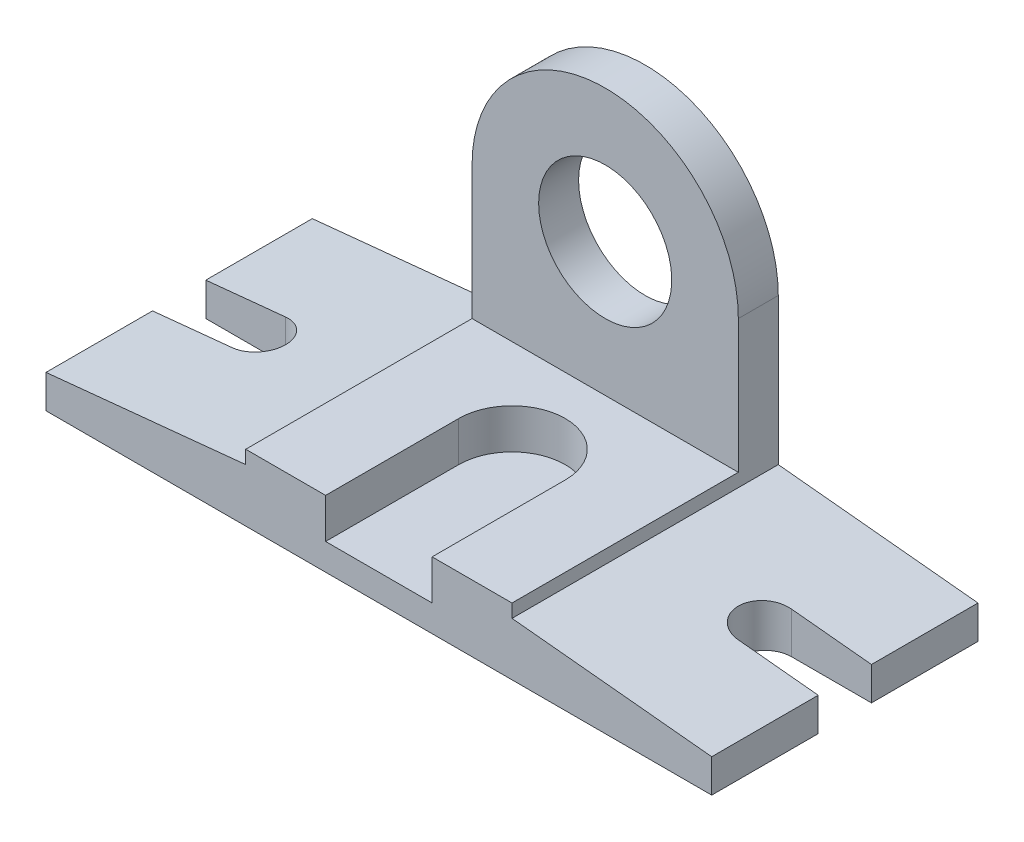
ISO-10303-21;
HEADER;
FILE_DESCRIPTION(('STEP AP214'),'2;1');
FILE_NAME('part.step','',(''),(''),'','','');
FILE_SCHEMA(('AUTOMOTIVE_DESIGN { 1 0 10303 214 1 1 1 1 }'));
ENDSEC;
DATA;
#1=APPLICATION_CONTEXT('core data for automotive mechanical design processes');
#2=APPLICATION_PROTOCOL_DEFINITION('international standard','automotive_design',2000,#1);
#3=PRODUCT_CONTEXT('',#1,'mechanical');
#4=PRODUCT('Part','Part','',(#3));
#5=PRODUCT_RELATED_PRODUCT_CATEGORY('part','',(#4));
#6=PRODUCT_DEFINITION_FORMATION('','',#4);
#7=PRODUCT_DEFINITION_CONTEXT('part definition',#1,'design');
#8=PRODUCT_DEFINITION('design','',#6,#7);
#9=PRODUCT_DEFINITION_SHAPE('','',#8);
#10=(LENGTH_UNIT() NAMED_UNIT(*) SI_UNIT(.MILLI.,.METRE.));
#11=(NAMED_UNIT(*) PLANE_ANGLE_UNIT() SI_UNIT($,.RADIAN.));
#12=(NAMED_UNIT(*) SI_UNIT($,.STERADIAN.) SOLID_ANGLE_UNIT());
#13=UNCERTAINTY_MEASURE_WITH_UNIT(LENGTH_MEASURE(1.E-05),#10,'distance_accuracy_value','');
#14=(GEOMETRIC_REPRESENTATION_CONTEXT(3) GLOBAL_UNCERTAINTY_ASSIGNED_CONTEXT((#13)) GLOBAL_UNIT_ASSIGNED_CONTEXT((#10,
#11,#12)) REPRESENTATION_CONTEXT('',''));
#15=CARTESIAN_POINT('',(0.,0.,0.));
#16=DIRECTION('',(0.,0.,1.));
#17=DIRECTION('',(1.,0.,0.));
#18=AXIS2_PLACEMENT_3D('',#15,#16,#17);
#19=CARTESIAN_POINT('',(-100.,50.,-200.));
#20=DIRECTION('',(0.,1.,0.));
#21=DIRECTION('',(0.,0.,1.));
#22=AXIS2_PLACEMENT_3D('',#19,#20,#21);
#23=PLANE('',#22);
#24=DIRECTION('',(0.,0.,1.));
#25=VECTOR('',#24,1.);
#26=CARTESIAN_POINT('',(100.,50.,-200.));
#27=LINE('',#26,#25);
#28=CARTESIAN_POINT('',(100.,50.,-170.));
#29=VERTEX_POINT('',#28);
#30=CARTESIAN_POINT('',(100.,50.,0.));
#31=VERTEX_POINT('',#30);
#32=EDGE_CURVE('E345',#29,#31,#27,.T.);
#33=ORIENTED_EDGE('',*,*,#32,.F.);
#34=DIRECTION('',(-1.,0.,0.));
#35=VECTOR('',#34,1.);
#36=CARTESIAN_POINT('',(-100.,50.,-170.));
#37=LINE('',#36,#35);
#38=CARTESIAN_POINT('',(-100.,50.,-170.));
#39=VERTEX_POINT('',#38);
#40=EDGE_CURVE('E217',#29,#39,#37,.T.);
#41=ORIENTED_EDGE('',*,*,#40,.T.);
#42=DIRECTION('',(0.,0.,1.));
#43=VECTOR('',#42,1.);
#44=CARTESIAN_POINT('',(-100.,50.,-200.));
#45=LINE('',#44,#43);
#46=CARTESIAN_POINT('',(-100.,50.,0.));
#47=VERTEX_POINT('',#46);
#48=EDGE_CURVE('E216',#39,#47,#45,.T.);
#49=ORIENTED_EDGE('',*,*,#48,.T.);
#50=DIRECTION('',(-1.,0.,0.));
#51=VECTOR('',#50,1.);
#52=CARTESIAN_POINT('',(-100.,50.,0.));
#53=LINE('',#52,#51);
#54=CARTESIAN_POINT('',(-40.,50.,0.));
#55=VERTEX_POINT('',#54);
#56=EDGE_CURVE('E333',#55,#47,#53,.T.);
#57=ORIENTED_EDGE('',*,*,#56,.F.);
#58=DIRECTION('',(0.,0.,1.));
#59=VECTOR('',#58,1.);
#60=CARTESIAN_POINT('',(-40.,50.,-100.));
#61=LINE('',#60,#59);
#62=CARTESIAN_POINT('',(-40.,50.,-100.));
#63=VERTEX_POINT('',#62);
#64=EDGE_CURVE('E285',#63,#55,#61,.T.);
#65=ORIENTED_EDGE('',*,*,#64,.F.);
#66=CARTESIAN_POINT('',(0.,50.,-100.));
#67=DIRECTION('',(0.,1.,0.));
#68=DIRECTION('',(0.,0.,1.));
#69=AXIS2_PLACEMENT_3D('',#66,#67,#68);
#70=CIRCLE('',#69,40.);
#71=CARTESIAN_POINT('',(40.,50.,-100.));
#72=VERTEX_POINT('',#71);
#73=EDGE_CURVE('E270',#72,#63,#70,.T.);
#74=ORIENTED_EDGE('',*,*,#73,.F.);
#75=DIRECTION('',(0.,0.,-1.));
#76=VECTOR('',#75,1.);
#77=CARTESIAN_POINT('',(40.,50.,-100.));
#78=LINE('',#77,#76);
#79=CARTESIAN_POINT('',(40.,50.,0.));
#80=VERTEX_POINT('',#79);
#81=EDGE_CURVE('E275',#80,#72,#78,.T.);
#82=ORIENTED_EDGE('',*,*,#81,.F.);
#83=EDGE_CURVE('E334',#31,#80,#53,.T.);
#84=ORIENTED_EDGE('',*,*,#83,.F.);
#85=EDGE_LOOP('',(#33,#41,#49,#57,#65,#74,#82,#84));
#86=FACE_BOUND('',#85,.T.);
#87=ADVANCED_FACE('F44',(#86),#23,.T.);
#88=CARTESIAN_POINT('',(-250.,0.,-200.));
#89=DIRECTION('',(-1.,0.,0.));
#90=DIRECTION('',(0.,0.,1.));
#91=AXIS2_PLACEMENT_3D('',#88,#89,#90);
#92=PLANE('',#91);
#93=DIRECTION('',(0.,-1.,0.));
#94=VECTOR('',#93,1.);
#95=CARTESIAN_POINT('',(-250.,50.,-120.));
#96=LINE('',#95,#94);
#97=CARTESIAN_POINT('',(-250.,25.,-120.));
#98=VERTEX_POINT('',#97);
#99=CARTESIAN_POINT('',(-250.,0.,-120.));
#100=VERTEX_POINT('',#99);
#101=EDGE_CURVE('E238',#98,#100,#96,.T.);
#102=ORIENTED_EDGE('',*,*,#101,.F.);
#103=DIRECTION('',(0.,0.,1.));
#104=VECTOR('',#103,1.);
#105=CARTESIAN_POINT('',(-250.,25.,-200.));
#106=LINE('',#105,#104);
#107=CARTESIAN_POINT('',(-250.,25.,-200.));
#108=VERTEX_POINT('',#107);
#109=EDGE_CURVE('E13',#108,#98,#106,.T.);
#110=ORIENTED_EDGE('',*,*,#109,.F.);
#111=DIRECTION('',(0.,-1.,0.));
#112=VECTOR('',#111,1.);
#113=CARTESIAN_POINT('',(-250.,0.,-200.));
#114=LINE('',#113,#112);
#115=CARTESIAN_POINT('',(-250.,0.,-200.));
#116=VERTEX_POINT('',#115);
#117=EDGE_CURVE('E298',#108,#116,#114,.T.);
#118=ORIENTED_EDGE('',*,*,#117,.T.);
#119=DIRECTION('',(0.,0.,1.));
#120=VECTOR('',#119,1.);
#121=CARTESIAN_POINT('',(-250.,0.,-200.));
#122=LINE('',#121,#120);
#123=EDGE_CURVE('E48',#116,#100,#122,.T.);
#124=ORIENTED_EDGE('',*,*,#123,.T.);
#125=EDGE_LOOP('',(#102,#110,#118,#124));
#126=FACE_BOUND('',#125,.T.);
#127=ADVANCED_FACE('F388',(#126),#92,.T.);
#128=CARTESIAN_POINT('',(250.,25.,-200.));
#129=DIRECTION('',(1.,0.,0.));
#130=DIRECTION('',(0.,0.,-1.));
#131=AXIS2_PLACEMENT_3D('',#128,#129,#130);
#132=PLANE('',#131);
#133=DIRECTION('',(0.,-1.,0.));
#134=VECTOR('',#133,1.);
#135=CARTESIAN_POINT('',(250.,50.,-80.));
#136=LINE('',#135,#134);
#137=CARTESIAN_POINT('',(250.,25.,-80.));
#138=VERTEX_POINT('',#137);
#139=CARTESIAN_POINT('',(250.,0.,-80.));
#140=VERTEX_POINT('',#139);
#141=EDGE_CURVE('E252',#138,#140,#136,.T.);
#142=ORIENTED_EDGE('',*,*,#141,.F.);
#143=DIRECTION('',(0.,0.,1.));
#144=VECTOR('',#143,1.);
#145=CARTESIAN_POINT('',(250.,25.,-200.));
#146=LINE('',#145,#144);
#147=CARTESIAN_POINT('',(250.,25.,0.));
#148=VERTEX_POINT('',#147);
#149=EDGE_CURVE('E351',#138,#148,#146,.T.);
#150=ORIENTED_EDGE('',*,*,#149,.T.);
#151=DIRECTION('',(0.,1.,0.));
#152=VECTOR('',#151,1.);
#153=CARTESIAN_POINT('',(250.,25.,0.));
#154=LINE('',#153,#152);
#155=CARTESIAN_POINT('',(250.,0.,0.));
#156=VERTEX_POINT('',#155);
#157=EDGE_CURVE('E324',#156,#148,#154,.T.);
#158=ORIENTED_EDGE('',*,*,#157,.F.);
#159=DIRECTION('',(0.,0.,1.));
#160=VECTOR('',#159,1.);
#161=CARTESIAN_POINT('',(250.,0.,-200.));
#162=LINE('',#161,#160);
#163=EDGE_CURVE('E354',#140,#156,#162,.T.);
#164=ORIENTED_EDGE('',*,*,#163,.F.);
#165=EDGE_LOOP('',(#142,#150,#158,#164));
#166=FACE_BOUND('',#165,.T.);
#167=ADVANCED_FACE('F415',(#166),#132,.T.);
#168=DIRECTION('',(0.,-1.,0.));
#169=VECTOR('',#168,1.);
#170=CARTESIAN_POINT('',(-250.,50.,-80.));
#171=LINE('',#170,#169);
#172=CARTESIAN_POINT('',(-250.,25.,-80.));
#173=VERTEX_POINT('',#172);
#174=CARTESIAN_POINT('',(-250.,0.,-80.));
#175=VERTEX_POINT('',#174);
#176=EDGE_CURVE('E240',#173,#175,#171,.T.);
#177=ORIENTED_EDGE('',*,*,#176,.T.);
#178=CARTESIAN_POINT('',(-250.,0.,0.));
#179=VERTEX_POINT('',#178);
#180=EDGE_CURVE('E318',#175,#179,#122,.T.);
#181=ORIENTED_EDGE('',*,*,#180,.T.);
#182=DIRECTION('',(0.,-1.,0.));
#183=VECTOR('',#182,1.);
#184=CARTESIAN_POINT('',(-250.,0.,0.));
#185=LINE('',#184,#183);
#186=CARTESIAN_POINT('',(-250.,25.,0.));
#187=VERTEX_POINT('',#186);
#188=EDGE_CURVE('E291',#187,#179,#185,.T.);
#189=ORIENTED_EDGE('',*,*,#188,.F.);
#190=EDGE_CURVE('E53',#173,#187,#106,.T.);
#191=ORIENTED_EDGE('',*,*,#190,.F.);
#192=EDGE_LOOP('',(#177,#181,#189,#191));
#193=FACE_BOUND('',#192,.T.);
#194=ADVANCED_FACE('F46',(#193),#92,.T.);
#195=CARTESIAN_POINT('',(-100.,40.,-200.));
#196=DIRECTION('',(-0.0995037190209989,0.995037190209989,0.));
#197=DIRECTION('',(-0.995037190209989,-0.0995037190209989,0.));
#198=AXIS2_PLACEMENT_3D('',#195,#196,#197);
#199=PLANE('',#198);
#200=DIRECTION('',(-0.995037190209989,-0.0995037190209989,0.));
#201=VECTOR('',#200,1.);
#202=CARTESIAN_POINT('',(-100.,40.,-120.));
#203=LINE('',#202,#201);
#204=CARTESIAN_POINT('',(-190.,31.,-120.));
#205=VERTEX_POINT('',#204);
#206=EDGE_CURVE('E266',#205,#98,#203,.T.);
#207=ORIENTED_EDGE('',*,*,#206,.F.);
#208=CARTESIAN_POINT('',(-190.,31.,-100.));
#209=DIRECTION('',(-0.0995037190209989,0.995037190209989,0.));
#210=DIRECTION('',(-0.995037190209989,-0.0995037190209989,0.));
#211=AXIS2_PLACEMENT_3D('',#208,#209,#210);
#212=ELLIPSE('',#211,20.0997512422418,20.);
#213=CARTESIAN_POINT('',(-190.,31.,-80.));
#214=VERTEX_POINT('',#213);
#215=EDGE_CURVE('E268',#214,#205,#212,.T.);
#216=ORIENTED_EDGE('',*,*,#215,.F.);
#217=DIRECTION('',(0.995037190209989,0.0995037190209989,0.));
#218=VECTOR('',#217,1.);
#219=CARTESIAN_POINT('',(-100.,40.,-80.));
#220=LINE('',#219,#218);
#221=EDGE_CURVE('E264',#173,#214,#220,.T.);
#222=ORIENTED_EDGE('',*,*,#221,.F.);
#223=ORIENTED_EDGE('',*,*,#190,.T.);
#224=DIRECTION('',(-0.995037190209989,-0.0995037190209989,0.));
#225=VECTOR('',#224,1.);
#226=CARTESIAN_POINT('',(-100.,40.,0.));
#227=LINE('',#226,#225);
#228=CARTESIAN_POINT('',(-100.,40.,0.));
#229=VERTEX_POINT('',#228);
#230=EDGE_CURVE('E302',#229,#187,#227,.T.);
#231=ORIENTED_EDGE('',*,*,#230,.F.);
#232=DIRECTION('',(0.,0.,1.));
#233=VECTOR('',#232,1.);
#234=CARTESIAN_POINT('',(-100.,40.,-200.));
#235=LINE('',#234,#233);
#236=CARTESIAN_POINT('',(-100.,40.,-200.));
#237=VERTEX_POINT('',#236);
#238=EDGE_CURVE('E342',#237,#229,#235,.T.);
#239=ORIENTED_EDGE('',*,*,#238,.F.);
#240=DIRECTION('',(-0.995037190209989,-0.0995037190209989,0.));
#241=VECTOR('',#240,1.);
#242=CARTESIAN_POINT('',(-100.,40.,-200.));
#243=LINE('',#242,#241);
#244=EDGE_CURVE('E315',#237,#108,#243,.T.);
#245=ORIENTED_EDGE('',*,*,#244,.T.);
#246=ORIENTED_EDGE('',*,*,#109,.T.);
#247=EDGE_LOOP('',(#207,#216,#222,#223,#231,#239,#245,#246));
#248=FACE_BOUND('',#247,.T.);
#249=ADVANCED_FACE('F377',(#248),#199,.T.);
#250=CARTESIAN_POINT('',(-100.,50.,-200.));
#251=DIRECTION('',(-1.,0.,0.));
#252=DIRECTION('',(0.,0.,1.));
#253=AXIS2_PLACEMENT_3D('',#250,#251,#252);
#254=PLANE('',#253);
#255=DIRECTION('',(0.,-1.,0.));
#256=VECTOR('',#255,1.);
#257=CARTESIAN_POINT('',(-100.,50.,0.));
#258=LINE('',#257,#256);
#259=EDGE_CURVE('E337',#47,#229,#258,.T.);
#260=ORIENTED_EDGE('',*,*,#259,.F.);
#261=ORIENTED_EDGE('',*,*,#48,.F.);
#262=DIRECTION('',(0.,1.,0.));
#263=VECTOR('',#262,1.);
#264=CARTESIAN_POINT('',(-100.,150.,-170.));
#265=LINE('',#264,#263);
#266=CARTESIAN_POINT('',(-100.,150.,-170.));
#267=VERTEX_POINT('',#266);
#268=EDGE_CURVE('E61',#39,#267,#265,.T.);
#269=ORIENTED_EDGE('',*,*,#268,.T.);
#270=DIRECTION('',(0.,0.,-1.));
#271=VECTOR('',#270,1.);
#272=CARTESIAN_POINT('',(-100.,150.,-170.));
#273=LINE('',#272,#271);
#274=CARTESIAN_POINT('',(-100.,150.,-200.));
#275=VERTEX_POINT('',#274);
#276=EDGE_CURVE('E198',#267,#275,#273,.T.);
#277=ORIENTED_EDGE('',*,*,#276,.T.);
#278=DIRECTION('',(0.,-1.,0.));
#279=VECTOR('',#278,1.);
#280=CARTESIAN_POINT('',(-100.,50.,-200.));
#281=LINE('',#280,#279);
#282=EDGE_CURVE('E313',#275,#237,#281,.T.);
#283=ORIENTED_EDGE('',*,*,#282,.T.);
#284=ORIENTED_EDGE('',*,*,#238,.T.);
#285=EDGE_LOOP('',(#260,#261,#269,#277,#283,#284));
#286=FACE_BOUND('',#285,.T.);
#287=ADVANCED_FACE('F215',(#286),#254,.T.);
#288=CARTESIAN_POINT('',(100.,50.,-200.));
#289=DIRECTION('',(1.,0.,0.));
#290=DIRECTION('',(0.,0.,-1.));
#291=AXIS2_PLACEMENT_3D('',#288,#289,#290);
#292=PLANE('',#291);
#293=DIRECTION('',(0.,1.,0.));
#294=VECTOR('',#293,1.);
#295=CARTESIAN_POINT('',(100.,50.,0.));
#296=LINE('',#295,#294);
#297=CARTESIAN_POINT('',(100.,40.,0.));
#298=VERTEX_POINT('',#297);
#299=EDGE_CURVE('E330',#298,#31,#296,.T.);
#300=ORIENTED_EDGE('',*,*,#299,.F.);
#301=DIRECTION('',(0.,0.,1.));
#302=VECTOR('',#301,1.);
#303=CARTESIAN_POINT('',(100.,40.,-200.));
#304=LINE('',#303,#302);
#305=CARTESIAN_POINT('',(100.,40.,-200.));
#306=VERTEX_POINT('',#305);
#307=EDGE_CURVE('E347',#306,#298,#304,.T.);
#308=ORIENTED_EDGE('',*,*,#307,.F.);
#309=DIRECTION('',(0.,1.,0.));
#310=VECTOR('',#309,1.);
#311=CARTESIAN_POINT('',(100.,50.,-200.));
#312=LINE('',#311,#310);
#313=CARTESIAN_POINT('',(100.,150.,-200.));
#314=VERTEX_POINT('',#313);
#315=EDGE_CURVE('E311',#306,#314,#312,.T.);
#316=ORIENTED_EDGE('',*,*,#315,.T.);
#317=DIRECTION('',(0.,0.,-1.));
#318=VECTOR('',#317,1.);
#319=CARTESIAN_POINT('',(100.,150.,-170.));
#320=LINE('',#319,#318);
#321=CARTESIAN_POINT('',(100.,150.,-170.));
#322=VERTEX_POINT('',#321);
#323=EDGE_CURVE('E207',#322,#314,#320,.T.);
#324=ORIENTED_EDGE('',*,*,#323,.F.);
#325=DIRECTION('',(0.,-1.,0.));
#326=VECTOR('',#325,1.);
#327=CARTESIAN_POINT('',(100.,50.,-170.));
#328=LINE('',#327,#326);
#329=EDGE_CURVE('E208',#322,#29,#328,.T.);
#330=ORIENTED_EDGE('',*,*,#329,.T.);
#331=ORIENTED_EDGE('',*,*,#32,.T.);
#332=EDGE_LOOP('',(#300,#308,#316,#324,#330,#331));
#333=FACE_BOUND('',#332,.T.);
#334=ADVANCED_FACE('F419',(#333),#292,.T.);
#335=CARTESIAN_POINT('',(100.,40.,-200.));
#336=DIRECTION('',(0.0995037190209989,0.995037190209989,0.));
#337=DIRECTION('',(-0.995037190209989,0.0995037190209989,0.));
#338=AXIS2_PLACEMENT_3D('',#335,#336,#337);
#339=PLANE('',#338);
#340=DIRECTION('',(0.995037190209989,-0.0995037190209989,0.));
#341=VECTOR('',#340,1.);
#342=CARTESIAN_POINT('',(100.,40.,-80.));
#343=LINE('',#342,#341);
#344=CARTESIAN_POINT('',(190.,31.,-80.));
#345=VERTEX_POINT('',#344);
#346=EDGE_CURVE('E260',#345,#138,#343,.T.);
#347=ORIENTED_EDGE('',*,*,#346,.F.);
#348=CARTESIAN_POINT('',(190.,31.,-100.));
#349=DIRECTION('',(0.0995037190209989,0.995037190209989,0.));
#350=DIRECTION('',(0.995037190209989,-0.0995037190209989,0.));
#351=AXIS2_PLACEMENT_3D('',#348,#349,#350);
#352=ELLIPSE('',#351,20.0997512422418,20.);
#353=CARTESIAN_POINT('',(190.,31.,-120.));
#354=VERTEX_POINT('',#353);
#355=EDGE_CURVE('E262',#354,#345,#352,.T.);
#356=ORIENTED_EDGE('',*,*,#355,.F.);
#357=DIRECTION('',(-0.995037190209989,0.0995037190209989,0.));
#358=VECTOR('',#357,1.);
#359=CARTESIAN_POINT('',(100.,40.,-120.));
#360=LINE('',#359,#358);
#361=CARTESIAN_POINT('',(250.,25.,-120.));
#362=VERTEX_POINT('',#361);
#363=EDGE_CURVE('E237',#362,#354,#360,.T.);
#364=ORIENTED_EDGE('',*,*,#363,.F.);
#365=CARTESIAN_POINT('',(250.,25.,-200.));
#366=VERTEX_POINT('',#365);
#367=EDGE_CURVE('E349',#366,#362,#146,.T.);
#368=ORIENTED_EDGE('',*,*,#367,.F.);
#369=DIRECTION('',(-0.995037190209989,0.0995037190209989,0.));
#370=VECTOR('',#369,1.);
#371=CARTESIAN_POINT('',(100.,40.,-200.));
#372=LINE('',#371,#370);
#373=EDGE_CURVE('E308',#366,#306,#372,.T.);
#374=ORIENTED_EDGE('',*,*,#373,.T.);
#375=ORIENTED_EDGE('',*,*,#307,.T.);
#376=DIRECTION('',(-0.995037190209989,0.0995037190209989,0.));
#377=VECTOR('',#376,1.);
#378=CARTESIAN_POINT('',(100.,40.,0.));
#379=LINE('',#378,#377);
#380=EDGE_CURVE('E327',#148,#298,#379,.T.);
#381=ORIENTED_EDGE('',*,*,#380,.F.);
#382=ORIENTED_EDGE('',*,*,#149,.F.);
#383=EDGE_LOOP('',(#347,#356,#364,#368,#374,#375,#381,#382));
#384=FACE_BOUND('',#383,.T.);
#385=ADVANCED_FACE('F405',(#384),#339,.T.);
#386=DIRECTION('',(0.,-1.,0.));
#387=VECTOR('',#386,1.);
#388=CARTESIAN_POINT('',(250.,50.,-120.));
#389=LINE('',#388,#387);
#390=CARTESIAN_POINT('',(250.,0.,-120.));
#391=VERTEX_POINT('',#390);
#392=EDGE_CURVE('E254',#362,#391,#389,.T.);
#393=ORIENTED_EDGE('',*,*,#392,.T.);
#394=CARTESIAN_POINT('',(250.,0.,-200.));
#395=VERTEX_POINT('',#394);
#396=EDGE_CURVE('E352',#395,#391,#162,.T.);
#397=ORIENTED_EDGE('',*,*,#396,.F.);
#398=DIRECTION('',(0.,1.,0.));
#399=VECTOR('',#398,1.);
#400=CARTESIAN_POINT('',(250.,25.,-200.));
#401=LINE('',#400,#399);
#402=EDGE_CURVE('E305',#395,#366,#401,.T.);
#403=ORIENTED_EDGE('',*,*,#402,.T.);
#404=ORIENTED_EDGE('',*,*,#367,.T.);
#405=EDGE_LOOP('',(#393,#397,#403,#404));
#406=FACE_BOUND('',#405,.T.);
#407=ADVANCED_FACE('F397',(#406),#132,.T.);
#408=CARTESIAN_POINT('',(-250.,0.,-200.));
#409=DIRECTION('',(0.,-1.,0.));
#410=DIRECTION('',(0.,0.,-1.));
#411=AXIS2_PLACEMENT_3D('',#408,#409,#410);
#412=PLANE('',#411);
#413=DIRECTION('',(1.,0.,0.));
#414=VECTOR('',#413,1.);
#415=CARTESIAN_POINT('',(-190.,0.,-120.));
#416=LINE('',#415,#414);
#417=CARTESIAN_POINT('',(-190.,0.,-120.));
#418=VERTEX_POINT('',#417);
#419=EDGE_CURVE('E231',#100,#418,#416,.T.);
#420=ORIENTED_EDGE('',*,*,#419,.F.);
#421=ORIENTED_EDGE('',*,*,#123,.F.);
#422=DIRECTION('',(1.,0.,0.));
#423=VECTOR('',#422,1.);
#424=CARTESIAN_POINT('',(-250.,0.,-200.));
#425=LINE('',#424,#423);
#426=EDGE_CURVE('E301',#116,#395,#425,.T.);
#427=ORIENTED_EDGE('',*,*,#426,.T.);
#428=ORIENTED_EDGE('',*,*,#396,.T.);
#429=DIRECTION('',(1.,0.,0.));
#430=VECTOR('',#429,1.);
#431=CARTESIAN_POINT('',(190.,0.,-120.));
#432=LINE('',#431,#430);
#433=CARTESIAN_POINT('',(190.,0.,-120.));
#434=VERTEX_POINT('',#433);
#435=EDGE_CURVE('E245',#434,#391,#432,.T.);
#436=ORIENTED_EDGE('',*,*,#435,.F.);
#437=CARTESIAN_POINT('',(190.,0.,-100.));
#438=DIRECTION('',(0.,-1.,0.));
#439=DIRECTION('',(0.,0.,1.));
#440=AXIS2_PLACEMENT_3D('',#437,#438,#439);
#441=CIRCLE('',#440,20.);
#442=CARTESIAN_POINT('',(190.,0.,-80.));
#443=VERTEX_POINT('',#442);
#444=EDGE_CURVE('E225',#443,#434,#441,.T.);
#445=ORIENTED_EDGE('',*,*,#444,.F.);
#446=DIRECTION('',(-1.,0.,0.));
#447=VECTOR('',#446,1.);
#448=CARTESIAN_POINT('',(190.,0.,-80.));
#449=LINE('',#448,#447);
#450=EDGE_CURVE('E247',#140,#443,#449,.T.);
#451=ORIENTED_EDGE('',*,*,#450,.F.);
#452=ORIENTED_EDGE('',*,*,#163,.T.);
#453=DIRECTION('',(1.,0.,0.));
#454=VECTOR('',#453,1.);
#455=CARTESIAN_POINT('',(-250.,0.,0.));
#456=LINE('',#455,#454);
#457=EDGE_CURVE('E321',#179,#156,#456,.T.);
#458=ORIENTED_EDGE('',*,*,#457,.F.);
#459=ORIENTED_EDGE('',*,*,#180,.F.);
#460=DIRECTION('',(-1.,0.,0.));
#461=VECTOR('',#460,1.);
#462=CARTESIAN_POINT('',(-190.,0.,-80.));
#463=LINE('',#462,#461);
#464=CARTESIAN_POINT('',(-190.,0.,-80.));
#465=VERTEX_POINT('',#464);
#466=EDGE_CURVE('E228',#465,#175,#463,.T.);
#467=ORIENTED_EDGE('',*,*,#466,.F.);
#468=CARTESIAN_POINT('',(-190.,0.,-100.));
#469=DIRECTION('',(0.,-1.,0.));
#470=DIRECTION('',(0.,0.,-1.));
#471=AXIS2_PLACEMENT_3D('',#468,#469,#470);
#472=CIRCLE('',#471,20.);
#473=EDGE_CURVE('E69',#418,#465,#472,.T.);
#474=ORIENTED_EDGE('',*,*,#473,.F.);
#475=EDGE_LOOP('',(#420,#421,#427,#428,#436,#445,#451,#452,#458,#459,#467,#474));
#476=FACE_BOUND('',#475,.T.);
#477=ADVANCED_FACE('F370',(#476),#412,.T.);
#478=CARTESIAN_POINT('',(0.,0.,-200.));
#479=DIRECTION('',(0.,0.,-1.));
#480=DIRECTION('',(-1.,0.,0.));
#481=AXIS2_PLACEMENT_3D('',#478,#479,#480);
#482=PLANE('',#481);
#483=ORIENTED_EDGE('',*,*,#117,.F.);
#484=ORIENTED_EDGE('',*,*,#244,.F.);
#485=ORIENTED_EDGE('',*,*,#282,.F.);
#486=CARTESIAN_POINT('',(0.,150.,-200.));
#487=DIRECTION('',(0.,0.,-1.));
#488=DIRECTION('',(-1.,0.,0.));
#489=AXIS2_PLACEMENT_3D('',#486,#487,#488);
#490=CIRCLE('',#489,100.);
#491=EDGE_CURVE('E204',#275,#314,#490,.T.);
#492=ORIENTED_EDGE('',*,*,#491,.T.);
#493=ORIENTED_EDGE('',*,*,#315,.F.);
#494=ORIENTED_EDGE('',*,*,#373,.F.);
#495=ORIENTED_EDGE('',*,*,#402,.F.);
#496=ORIENTED_EDGE('',*,*,#426,.F.);
#497=EDGE_LOOP('',(#483,#484,#485,#492,#493,#494,#495,#496));
#498=FACE_BOUND('',#497,.T.);
#499=CARTESIAN_POINT('',(0.,150.,-200.));
#500=DIRECTION('',(0.,0.,-1.));
#501=DIRECTION('',(-1.,0.,0.));
#502=AXIS2_PLACEMENT_3D('',#499,#500,#501);
#503=CIRCLE('',#502,50.);
#504=CARTESIAN_POINT('',(-50.,150.,-200.));
#505=VERTEX_POINT('',#504);
#506=EDGE_CURVE('E646',#505,#505,#503,.T.);
#507=ORIENTED_EDGE('',*,*,#506,.F.);
#508=EDGE_LOOP('',(#507));
#509=FACE_BOUND('',#508,.T.);
#510=ADVANCED_FACE('F391',(#498,#509),#482,.T.);
#511=CARTESIAN_POINT('',(0.,0.,0.));
#512=DIRECTION('',(0.,0.,-1.));
#513=DIRECTION('',(-1.,0.,0.));
#514=AXIS2_PLACEMENT_3D('',#511,#512,#513);
#515=PLANE('',#514);
#516=ORIENTED_EDGE('',*,*,#83,.T.);
#517=DIRECTION('',(0.,1.,0.));
#518=VECTOR('',#517,1.);
#519=CARTESIAN_POINT('',(40.,20.,0.));
#520=LINE('',#519,#518);
#521=CARTESIAN_POINT('',(40.,20.,0.));
#522=VERTEX_POINT('',#521);
#523=EDGE_CURVE('E292',#522,#80,#520,.T.);
#524=ORIENTED_EDGE('',*,*,#523,.F.);
#525=DIRECTION('',(1.,0.,0.));
#526=VECTOR('',#525,1.);
#527=CARTESIAN_POINT('',(40.,20.,0.));
#528=LINE('',#527,#526);
#529=CARTESIAN_POINT('',(-40.,20.,0.));
#530=VERTEX_POINT('',#529);
#531=EDGE_CURVE('E277',#530,#522,#528,.T.);
#532=ORIENTED_EDGE('',*,*,#531,.F.);
#533=DIRECTION('',(0.,1.,0.));
#534=VECTOR('',#533,1.);
#535=CARTESIAN_POINT('',(-40.,20.,0.));
#536=LINE('',#535,#534);
#537=EDGE_CURVE('E294',#530,#55,#536,.T.);
#538=ORIENTED_EDGE('',*,*,#537,.T.);
#539=ORIENTED_EDGE('',*,*,#56,.T.);
#540=ORIENTED_EDGE('',*,*,#259,.T.);
#541=ORIENTED_EDGE('',*,*,#230,.T.);
#542=ORIENTED_EDGE('',*,*,#188,.T.);
#543=ORIENTED_EDGE('',*,*,#457,.T.);
#544=ORIENTED_EDGE('',*,*,#157,.T.);
#545=ORIENTED_EDGE('',*,*,#380,.T.);
#546=ORIENTED_EDGE('',*,*,#299,.T.);
#547=EDGE_LOOP('',(#516,#524,#532,#538,#539,#540,#541,#542,#543,#544,#545,#546));
#548=FACE_BOUND('',#547,.T.);
#549=ADVANCED_FACE('F372',(#548),#515,.F.);
#550=CARTESIAN_POINT('',(0.,20.,-100.));
#551=DIRECTION('',(0.,1.,0.));
#552=DIRECTION('',(0.,0.,1.));
#553=AXIS2_PLACEMENT_3D('',#550,#551,#552);
#554=CYLINDRICAL_SURFACE('',#553,40.);
#555=ORIENTED_EDGE('',*,*,#73,.T.);
#556=DIRECTION('',(0.,1.,0.));
#557=VECTOR('',#556,1.);
#558=CARTESIAN_POINT('',(-40.,20.,-100.));
#559=LINE('',#558,#557);
#560=CARTESIAN_POINT('',(-40.,20.,-100.));
#561=VERTEX_POINT('',#560);
#562=EDGE_CURVE('E282',#561,#63,#559,.T.);
#563=ORIENTED_EDGE('',*,*,#562,.F.);
#564=CARTESIAN_POINT('',(0.,20.,-100.));
#565=DIRECTION('',(0.,1.,0.));
#566=DIRECTION('',(0.,0.,1.));
#567=AXIS2_PLACEMENT_3D('',#564,#565,#566);
#568=CIRCLE('',#567,40.);
#569=CARTESIAN_POINT('',(40.,20.,-100.));
#570=VERTEX_POINT('',#569);
#571=EDGE_CURVE('E271',#570,#561,#568,.T.);
#572=ORIENTED_EDGE('',*,*,#571,.F.);
#573=DIRECTION('',(0.,1.,0.));
#574=VECTOR('',#573,1.);
#575=CARTESIAN_POINT('',(40.,20.,-100.));
#576=LINE('',#575,#574);
#577=EDGE_CURVE('E289',#570,#72,#576,.T.);
#578=ORIENTED_EDGE('',*,*,#577,.T.);
#579=EDGE_LOOP('',(#555,#563,#572,#578));
#580=FACE_BOUND('',#579,.T.);
#581=ADVANCED_FACE('F440',(#580),#554,.F.);
#582=CARTESIAN_POINT('',(40.,20.,-100.));
#583=DIRECTION('',(1.,0.,0.));
#584=DIRECTION('',(0.,0.,-1.));
#585=AXIS2_PLACEMENT_3D('',#582,#583,#584);
#586=PLANE('',#585);
#587=ORIENTED_EDGE('',*,*,#81,.T.);
#588=ORIENTED_EDGE('',*,*,#577,.F.);
#589=DIRECTION('',(0.,0.,-1.));
#590=VECTOR('',#589,1.);
#591=CARTESIAN_POINT('',(40.,20.,-100.));
#592=LINE('',#591,#590);
#593=EDGE_CURVE('E279',#522,#570,#592,.T.);
#594=ORIENTED_EDGE('',*,*,#593,.F.);
#595=ORIENTED_EDGE('',*,*,#523,.T.);
#596=EDGE_LOOP('',(#587,#588,#594,#595));
#597=FACE_BOUND('',#596,.T.);
#598=ADVANCED_FACE('F429',(#597),#586,.F.);
#599=CARTESIAN_POINT('',(-40.,20.,-100.));
#600=DIRECTION('',(-1.,0.,0.));
#601=DIRECTION('',(0.,0.,1.));
#602=AXIS2_PLACEMENT_3D('',#599,#600,#601);
#603=PLANE('',#602);
#604=ORIENTED_EDGE('',*,*,#64,.T.);
#605=ORIENTED_EDGE('',*,*,#537,.F.);
#606=DIRECTION('',(0.,0.,1.));
#607=VECTOR('',#606,1.);
#608=CARTESIAN_POINT('',(-40.,20.,-100.));
#609=LINE('',#608,#607);
#610=EDGE_CURVE('E274',#561,#530,#609,.T.);
#611=ORIENTED_EDGE('',*,*,#610,.F.);
#612=ORIENTED_EDGE('',*,*,#562,.T.);
#613=EDGE_LOOP('',(#604,#605,#611,#612));
#614=FACE_BOUND('',#613,.T.);
#615=ADVANCED_FACE('F436',(#614),#603,.F.);
#616=CARTESIAN_POINT('',(0.,20.,-100.));
#617=DIRECTION('',(0.,1.,0.));
#618=DIRECTION('',(0.,0.,1.));
#619=AXIS2_PLACEMENT_3D('',#616,#617,#618);
#620=PLANE('',#619);
#621=ORIENTED_EDGE('',*,*,#571,.T.);
#622=ORIENTED_EDGE('',*,*,#610,.T.);
#623=ORIENTED_EDGE('',*,*,#531,.T.);
#624=ORIENTED_EDGE('',*,*,#593,.T.);
#625=EDGE_LOOP('',(#621,#622,#623,#624));
#626=FACE_BOUND('',#625,.T.);
#627=ADVANCED_FACE('F432',(#626),#620,.T.);
#628=CARTESIAN_POINT('',(190.,50.,-100.));
#629=DIRECTION('',(0.,-1.,0.));
#630=DIRECTION('',(0.,0.,-1.));
#631=AXIS2_PLACEMENT_3D('',#628,#629,#630);
#632=CYLINDRICAL_SURFACE('',#631,20.);
#633=ORIENTED_EDGE('',*,*,#355,.T.);
#634=DIRECTION('',(0.,-1.,0.));
#635=VECTOR('',#634,1.);
#636=CARTESIAN_POINT('',(190.,50.,-80.));
#637=LINE('',#636,#635);
#638=EDGE_CURVE('E229',#345,#443,#637,.T.);
#639=ORIENTED_EDGE('',*,*,#638,.T.);
#640=ORIENTED_EDGE('',*,*,#444,.T.);
#641=DIRECTION('',(0.,-1.,0.));
#642=VECTOR('',#641,1.);
#643=CARTESIAN_POINT('',(190.,50.,-120.));
#644=LINE('',#643,#642);
#645=EDGE_CURVE('E250',#354,#434,#644,.T.);
#646=ORIENTED_EDGE('',*,*,#645,.F.);
#647=EDGE_LOOP('',(#633,#639,#640,#646));
#648=FACE_BOUND('',#647,.T.);
#649=ADVANCED_FACE('F409',(#648),#632,.F.);
#650=CARTESIAN_POINT('',(190.,50.,-80.));
#651=DIRECTION('',(0.,0.,1.));
#652=DIRECTION('',(1.,0.,0.));
#653=AXIS2_PLACEMENT_3D('',#650,#651,#652);
#654=PLANE('',#653);
#655=ORIENTED_EDGE('',*,*,#346,.T.);
#656=ORIENTED_EDGE('',*,*,#141,.T.);
#657=ORIENTED_EDGE('',*,*,#450,.T.);
#658=ORIENTED_EDGE('',*,*,#638,.F.);
#659=EDGE_LOOP('',(#655,#656,#657,#658));
#660=FACE_BOUND('',#659,.T.);
#661=ADVANCED_FACE('F411',(#660),#654,.F.);
#662=CARTESIAN_POINT('',(190.,50.,-120.));
#663=DIRECTION('',(0.,0.,-1.));
#664=DIRECTION('',(-1.,0.,0.));
#665=AXIS2_PLACEMENT_3D('',#662,#663,#664);
#666=PLANE('',#665);
#667=ORIENTED_EDGE('',*,*,#363,.T.);
#668=ORIENTED_EDGE('',*,*,#645,.T.);
#669=ORIENTED_EDGE('',*,*,#435,.T.);
#670=ORIENTED_EDGE('',*,*,#392,.F.);
#671=EDGE_LOOP('',(#667,#668,#669,#670));
#672=FACE_BOUND('',#671,.T.);
#673=ADVANCED_FACE('F400',(#672),#666,.F.);
#674=CARTESIAN_POINT('',(-190.,50.,-100.));
#675=DIRECTION('',(0.,-1.,0.));
#676=DIRECTION('',(0.,0.,-1.));
#677=AXIS2_PLACEMENT_3D('',#674,#675,#676);
#678=CYLINDRICAL_SURFACE('',#677,20.);
#679=ORIENTED_EDGE('',*,*,#215,.T.);
#680=DIRECTION('',(0.,-1.,0.));
#681=VECTOR('',#680,1.);
#682=CARTESIAN_POINT('',(-190.,50.,-120.));
#683=LINE('',#682,#681);
#684=EDGE_CURVE('E235',#205,#418,#683,.T.);
#685=ORIENTED_EDGE('',*,*,#684,.T.);
#686=ORIENTED_EDGE('',*,*,#473,.T.);
#687=DIRECTION('',(0.,-1.,0.));
#688=VECTOR('',#687,1.);
#689=CARTESIAN_POINT('',(-190.,50.,-80.));
#690=LINE('',#689,#688);
#691=EDGE_CURVE('E234',#214,#465,#690,.T.);
#692=ORIENTED_EDGE('',*,*,#691,.F.);
#693=EDGE_LOOP('',(#679,#685,#686,#692));
#694=FACE_BOUND('',#693,.T.);
#695=ADVANCED_FACE('F382',(#694),#678,.F.);
#696=CARTESIAN_POINT('',(-190.,50.,-120.));
#697=DIRECTION('',(0.,0.,-1.));
#698=DIRECTION('',(-1.,0.,0.));
#699=AXIS2_PLACEMENT_3D('',#696,#697,#698);
#700=PLANE('',#699);
#701=ORIENTED_EDGE('',*,*,#206,.T.);
#702=ORIENTED_EDGE('',*,*,#101,.T.);
#703=ORIENTED_EDGE('',*,*,#419,.T.);
#704=ORIENTED_EDGE('',*,*,#684,.F.);
#705=EDGE_LOOP('',(#701,#702,#703,#704));
#706=FACE_BOUND('',#705,.T.);
#707=ADVANCED_FACE('F385',(#706),#700,.F.);
#708=CARTESIAN_POINT('',(-190.,50.,-80.));
#709=DIRECTION('',(0.,0.,1.));
#710=DIRECTION('',(1.,0.,0.));
#711=AXIS2_PLACEMENT_3D('',#708,#709,#710);
#712=PLANE('',#711);
#713=ORIENTED_EDGE('',*,*,#221,.T.);
#714=ORIENTED_EDGE('',*,*,#691,.T.);
#715=ORIENTED_EDGE('',*,*,#466,.T.);
#716=ORIENTED_EDGE('',*,*,#176,.F.);
#717=EDGE_LOOP('',(#713,#714,#715,#716));
#718=FACE_BOUND('',#717,.T.);
#719=ADVANCED_FACE('F381',(#718),#712,.F.);
#720=CARTESIAN_POINT('',(0.,150.,-170.));
#721=DIRECTION('',(0.,0.,-1.));
#722=DIRECTION('',(-1.,0.,0.));
#723=AXIS2_PLACEMENT_3D('',#720,#721,#722);
#724=CYLINDRICAL_SURFACE('',#723,100.);
#725=ORIENTED_EDGE('',*,*,#491,.F.);
#726=ORIENTED_EDGE('',*,*,#276,.F.);
#727=CARTESIAN_POINT('',(0.,150.,-170.));
#728=DIRECTION('',(0.,0.,-1.));
#729=DIRECTION('',(-1.,0.,0.));
#730=AXIS2_PLACEMENT_3D('',#727,#728,#729);
#731=CIRCLE('',#730,100.);
#732=EDGE_CURVE('E201',#267,#322,#731,.T.);
#733=ORIENTED_EDGE('',*,*,#732,.T.);
#734=ORIENTED_EDGE('',*,*,#323,.T.);
#735=EDGE_LOOP('',(#725,#726,#733,#734));
#736=FACE_BOUND('',#735,.T.);
#737=ADVANCED_FACE('F199',(#736),#724,.T.);
#738=CARTESIAN_POINT('',(0.,150.,-170.));
#739=DIRECTION('',(0.,0.,-1.));
#740=DIRECTION('',(-1.,0.,0.));
#741=AXIS2_PLACEMENT_3D('',#738,#739,#740);
#742=PLANE('',#741);
#743=CARTESIAN_POINT('',(0.,150.,-170.));
#744=DIRECTION('',(0.,0.,-1.));
#745=DIRECTION('',(-1.,0.,0.));
#746=AXIS2_PLACEMENT_3D('',#743,#744,#745);
#747=CIRCLE('',#746,50.);
#748=CARTESIAN_POINT('',(-50.,150.,-170.));
#749=VERTEX_POINT('',#748);
#750=EDGE_CURVE('E224',#749,#749,#747,.T.);
#751=ORIENTED_EDGE('',*,*,#750,.T.);
#752=EDGE_LOOP('',(#751));
#753=FACE_BOUND('',#752,.T.);
#754=ORIENTED_EDGE('',*,*,#40,.F.);
#755=ORIENTED_EDGE('',*,*,#329,.F.);
#756=ORIENTED_EDGE('',*,*,#732,.F.);
#757=ORIENTED_EDGE('',*,*,#268,.F.);
#758=EDGE_LOOP('',(#754,#755,#756,#757));
#759=FACE_BOUND('',#758,.T.);
#760=ADVANCED_FACE('F210',(#753,#759),#742,.F.);
#761=CARTESIAN_POINT('',(0.,150.,-170.));
#762=DIRECTION('',(0.,0.,-1.));
#763=DIRECTION('',(-1.,0.,0.));
#764=AXIS2_PLACEMENT_3D('',#761,#762,#763);
#765=CYLINDRICAL_SURFACE('',#764,50.);
#766=ORIENTED_EDGE('',*,*,#750,.F.);
#767=EDGE_LOOP('',(#766));
#768=FACE_BOUND('',#767,.T.);
#769=ORIENTED_EDGE('',*,*,#506,.T.);
#770=EDGE_LOOP('',(#769));
#771=FACE_BOUND('',#770,.T.);
#772=ADVANCED_FACE('F624',(#768,#771),#765,.F.);
#773=CLOSED_SHELL('',(#87,#127,#167,#194,#249,#287,#334,#385,#407,#477,#510,#549,#581,#598,#615,
#627,#649,#661,#673,#695,#707,#719,#737,#760,#772));
#774=MANIFOLD_SOLID_BREP('B2',#773);
#775=ADVANCED_BREP_SHAPE_REPRESENTATION('',(#18,#774),#14);
#776=SHAPE_DEFINITION_REPRESENTATION(#9,#775);
ENDSEC;
END-ISO-10303-21;
